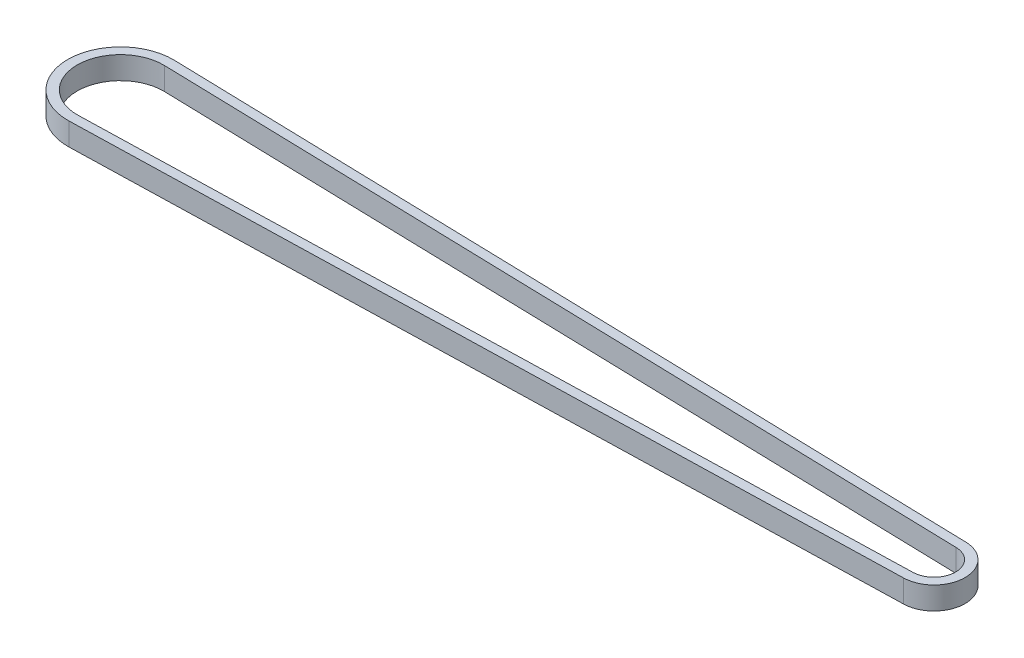
ISO-10303-21;
HEADER;
FILE_DESCRIPTION(('STEP AP214'),'2;1');
FILE_NAME('part.step','',(''),(''),'','','');
FILE_SCHEMA(('AUTOMOTIVE_DESIGN { 1 0 10303 214 1 1 1 1 }'));
ENDSEC;
DATA;
#1=APPLICATION_CONTEXT('core data for automotive mechanical design processes');
#2=APPLICATION_PROTOCOL_DEFINITION('international standard','automotive_design',2000,#1);
#3=PRODUCT_CONTEXT('',#1,'mechanical');
#4=PRODUCT('Part','Part','',(#3));
#5=PRODUCT_RELATED_PRODUCT_CATEGORY('part','',(#4));
#6=PRODUCT_DEFINITION_FORMATION('','',#4);
#7=PRODUCT_DEFINITION_CONTEXT('part definition',#1,'design');
#8=PRODUCT_DEFINITION('design','',#6,#7);
#9=PRODUCT_DEFINITION_SHAPE('','',#8);
#10=(LENGTH_UNIT() NAMED_UNIT(*) SI_UNIT(.MILLI.,.METRE.));
#11=(NAMED_UNIT(*) PLANE_ANGLE_UNIT() SI_UNIT($,.RADIAN.));
#12=(NAMED_UNIT(*) SI_UNIT($,.STERADIAN.) SOLID_ANGLE_UNIT());
#13=UNCERTAINTY_MEASURE_WITH_UNIT(LENGTH_MEASURE(1.E-05),#10,'distance_accuracy_value','');
#14=(GEOMETRIC_REPRESENTATION_CONTEXT(3) GLOBAL_UNCERTAINTY_ASSIGNED_CONTEXT((#13)) GLOBAL_UNIT_ASSIGNED_CONTEXT((#10,
#11,#12)) REPRESENTATION_CONTEXT('',''));
#15=CARTESIAN_POINT('',(0.,0.,0.));
#16=DIRECTION('',(0.,0.,1.));
#17=DIRECTION('',(1.,0.,0.));
#18=AXIS2_PLACEMENT_3D('',#15,#16,#17);
#19=CARTESIAN_POINT('',(-107.95,5.9944,0.));
#20=DIRECTION('',(0.,1.,0.));
#21=DIRECTION('',(0.,0.,1.));
#22=AXIS2_PLACEMENT_3D('',#19,#20,#21);
#23=PLANE('',#22);
#24=CARTESIAN_POINT('',(-107.95,5.9944,0.));
#25=DIRECTION('',(0.,1.,0.));
#26=DIRECTION('',(0.,0.,1.));
#27=AXIS2_PLACEMENT_3D('',#24,#25,#26);
#28=CIRCLE('',#27,13.97);
#29=CARTESIAN_POINT('',(-107.580205882353,5.9944,-13.9651048084343));
#30=VERTEX_POINT('',#29);
#31=CARTESIAN_POINT('',(-107.580205882353,5.9944,13.9651048084343));
#32=VERTEX_POINT('',#31);
#33=EDGE_CURVE('E159',#30,#32,#28,.T.);
#34=ORIENTED_EDGE('',*,*,#33,.T.);
#35=DIRECTION('',(0.999649592586561,0.,-0.0264705882352941));
#36=VECTOR('',#35,1.);
#37=CARTESIAN_POINT('',(-107.580205882353,5.9944,13.9651048084343));
#38=LINE('',#37,#36);
#39=CARTESIAN_POINT('',(108.168514705882,5.9944,8.25210738680207));
#40=VERTEX_POINT('',#39);
#41=EDGE_CURVE('E163',#32,#40,#38,.T.);
#42=ORIENTED_EDGE('',*,*,#41,.T.);
#43=CARTESIAN_POINT('',(107.95,5.9944,0.));
#44=DIRECTION('',(0.,1.,0.));
#45=DIRECTION('',(0.,0.,1.));
#46=AXIS2_PLACEMENT_3D('',#43,#44,#45);
#47=CIRCLE('',#46,8.255);
#48=CARTESIAN_POINT('',(108.168514705882,5.9944,-8.25210738680206));
#49=VERTEX_POINT('',#48);
#50=EDGE_CURVE('E167',#40,#49,#47,.T.);
#51=ORIENTED_EDGE('',*,*,#50,.T.);
#52=DIRECTION('',(-0.999649592586561,0.,-0.0264705882352941));
#53=VECTOR('',#52,1.);
#54=CARTESIAN_POINT('',(-107.580205882353,5.9944,-13.9651048084343));
#55=LINE('',#54,#53);
#56=EDGE_CURVE('E170',#49,#30,#55,.T.);
#57=ORIENTED_EDGE('',*,*,#56,.T.);
#58=EDGE_LOOP('',(#34,#42,#51,#57));
#59=FACE_BOUND('',#58,.T.);
#60=DIRECTION('',(0.99964818930839,0.,-0.0265235294117647));
#61=VECTOR('',#60,1.);
#62=CARTESIAN_POINT('',(-107.646162361176,5.9944,11.4513698678033));
#63=LINE('',#62,#61);
#64=CARTESIAN_POINT('',(-107.646162361176,5.9944,11.4513698678033));
#65=VERTEX_POINT('',#64);
#66=CARTESIAN_POINT('',(108.101952504294,5.9944,5.72695448710209));
#67=VERTEX_POINT('',#66);
#68=EDGE_CURVE('E120',#65,#67,#63,.T.);
#69=ORIENTED_EDGE('',*,*,#68,.F.);
#70=CARTESIAN_POINT('',(-107.95,5.9944,0.));
#71=DIRECTION('',(0.,1.,0.));
#72=DIRECTION('',(0.,0.,1.));
#73=AXIS2_PLACEMENT_3D('',#70,#71,#72);
#74=CIRCLE('',#73,11.4554);
#75=CARTESIAN_POINT('',(-107.646162361176,5.9944,-11.4513698678033));
#76=VERTEX_POINT('',#75);
#77=EDGE_CURVE('E111',#76,#65,#74,.T.);
#78=ORIENTED_EDGE('',*,*,#77,.F.);
#79=DIRECTION('',(-0.99964818930839,0.,-0.0265235294117647));
#80=VECTOR('',#79,1.);
#81=CARTESIAN_POINT('',(-107.646162361176,5.9944,-11.4513698678033));
#82=LINE('',#81,#80);
#83=CARTESIAN_POINT('',(108.101952504294,5.9944,-5.72695448710209));
#84=VERTEX_POINT('',#83);
#85=EDGE_CURVE('E137',#84,#76,#82,.T.);
#86=ORIENTED_EDGE('',*,*,#85,.F.);
#87=CARTESIAN_POINT('',(107.95,5.9944,0.));
#88=DIRECTION('',(0.,1.,0.));
#89=DIRECTION('',(0.,0.,1.));
#90=AXIS2_PLACEMENT_3D('',#87,#88,#89);
#91=CIRCLE('',#90,5.72897);
#92=EDGE_CURVE('E133',#67,#84,#91,.T.);
#93=ORIENTED_EDGE('',*,*,#92,.F.);
#94=EDGE_LOOP('',(#69,#78,#86,#93));
#95=FACE_BOUND('',#94,.T.);
#96=ADVANCED_FACE('F45',(#59,#95),#23,.T.);
#97=CARTESIAN_POINT('',(-107.95,0.,0.));
#98=DIRECTION('',(0.,1.,0.));
#99=DIRECTION('',(0.,0.,1.));
#100=AXIS2_PLACEMENT_3D('',#97,#98,#99);
#101=PLANE('',#100);
#102=CARTESIAN_POINT('',(-107.95,0.,0.));
#103=DIRECTION('',(0.,1.,0.));
#104=DIRECTION('',(0.,0.,1.));
#105=AXIS2_PLACEMENT_3D('',#102,#103,#104);
#106=CIRCLE('',#105,13.97);
#107=CARTESIAN_POINT('',(-107.580205882353,0.,-13.9651048084343));
#108=VERTEX_POINT('',#107);
#109=CARTESIAN_POINT('',(-107.580205882353,0.,13.9651048084343));
#110=VERTEX_POINT('',#109);
#111=EDGE_CURVE('E129',#108,#110,#106,.T.);
#112=ORIENTED_EDGE('',*,*,#111,.F.);
#113=DIRECTION('',(-0.999649592586561,0.,-0.0264705882352941));
#114=VECTOR('',#113,1.);
#115=CARTESIAN_POINT('',(-107.580205882353,0.,-13.9651048084343));
#116=LINE('',#115,#114);
#117=CARTESIAN_POINT('',(108.168514705882,0.,-8.25210738680206));
#118=VERTEX_POINT('',#117);
#119=EDGE_CURVE('E164',#118,#108,#116,.T.);
#120=ORIENTED_EDGE('',*,*,#119,.F.);
#121=CARTESIAN_POINT('',(107.95,0.,0.));
#122=DIRECTION('',(0.,1.,0.));
#123=DIRECTION('',(0.,0.,1.));
#124=AXIS2_PLACEMENT_3D('',#121,#122,#123);
#125=CIRCLE('',#124,8.255);
#126=CARTESIAN_POINT('',(108.168514705882,0.,8.25210738680207));
#127=VERTEX_POINT('',#126);
#128=EDGE_CURVE('E180',#127,#118,#125,.T.);
#129=ORIENTED_EDGE('',*,*,#128,.F.);
#130=DIRECTION('',(0.999649592586561,0.,-0.0264705882352941));
#131=VECTOR('',#130,1.);
#132=CARTESIAN_POINT('',(-107.580205882353,0.,13.9651048084343));
#133=LINE('',#132,#131);
#134=EDGE_CURVE('E177',#110,#127,#133,.T.);
#135=ORIENTED_EDGE('',*,*,#134,.F.);
#136=EDGE_LOOP('',(#112,#120,#129,#135));
#137=FACE_BOUND('',#136,.T.);
#138=CARTESIAN_POINT('',(-107.95,0.,0.));
#139=DIRECTION('',(0.,1.,0.));
#140=DIRECTION('',(0.,0.,1.));
#141=AXIS2_PLACEMENT_3D('',#138,#139,#140);
#142=CIRCLE('',#141,11.4554);
#143=CARTESIAN_POINT('',(-107.646162361176,0.,-11.4513698678033));
#144=VERTEX_POINT('',#143);
#145=CARTESIAN_POINT('',(-107.646162361176,0.,11.4513698678033));
#146=VERTEX_POINT('',#145);
#147=EDGE_CURVE('E69',#144,#146,#142,.T.);
#148=ORIENTED_EDGE('',*,*,#147,.T.);
#149=DIRECTION('',(0.99964818930839,0.,-0.0265235294117647));
#150=VECTOR('',#149,1.);
#151=CARTESIAN_POINT('',(-107.646162361176,0.,11.4513698678033));
#152=LINE('',#151,#150);
#153=CARTESIAN_POINT('',(108.101952504294,0.,5.72695448710209));
#154=VERTEX_POINT('',#153);
#155=EDGE_CURVE('E127',#146,#154,#152,.T.);
#156=ORIENTED_EDGE('',*,*,#155,.T.);
#157=CARTESIAN_POINT('',(107.95,0.,0.));
#158=DIRECTION('',(0.,1.,0.));
#159=DIRECTION('',(0.,0.,1.));
#160=AXIS2_PLACEMENT_3D('',#157,#158,#159);
#161=CIRCLE('',#160,5.72897);
#162=CARTESIAN_POINT('',(108.101952504294,0.,-5.72695448710209));
#163=VERTEX_POINT('',#162);
#164=EDGE_CURVE('E146',#154,#163,#161,.T.);
#165=ORIENTED_EDGE('',*,*,#164,.T.);
#166=DIRECTION('',(-0.99964818930839,0.,-0.0265235294117647));
#167=VECTOR('',#166,1.);
#168=CARTESIAN_POINT('',(-107.646162361176,0.,-11.4513698678033));
#169=LINE('',#168,#167);
#170=EDGE_CURVE('E121',#163,#144,#169,.T.);
#171=ORIENTED_EDGE('',*,*,#170,.T.);
#172=EDGE_LOOP('',(#148,#156,#165,#171));
#173=FACE_BOUND('',#172,.T.);
#174=ADVANCED_FACE('F203',(#137,#173),#101,.F.);
#175=CARTESIAN_POINT('',(-107.95,5.9944,0.));
#176=DIRECTION('',(0.,-1.,0.));
#177=DIRECTION('',(0.,0.,-1.));
#178=AXIS2_PLACEMENT_3D('',#175,#176,#177);
#179=CYLINDRICAL_SURFACE('',#178,13.97);
#180=ORIENTED_EDGE('',*,*,#111,.T.);
#181=DIRECTION('',(0.,-1.,0.));
#182=VECTOR('',#181,1.);
#183=CARTESIAN_POINT('',(-107.580205882353,5.9944,13.9651048084343));
#184=LINE('',#183,#182);
#185=EDGE_CURVE('E11',#32,#110,#184,.T.);
#186=ORIENTED_EDGE('',*,*,#185,.F.);
#187=ORIENTED_EDGE('',*,*,#33,.F.);
#188=DIRECTION('',(0.,-1.,0.));
#189=VECTOR('',#188,1.);
#190=CARTESIAN_POINT('',(-107.580205882353,5.9944,-13.9651048084343));
#191=LINE('',#190,#189);
#192=EDGE_CURVE('E173',#30,#108,#191,.T.);
#193=ORIENTED_EDGE('',*,*,#192,.T.);
#194=EDGE_LOOP('',(#180,#186,#187,#193));
#195=FACE_BOUND('',#194,.T.);
#196=ADVANCED_FACE('F47',(#195),#179,.T.);
#197=CARTESIAN_POINT('',(-107.580205882353,5.9944,13.9651048084343));
#198=DIRECTION('',(-0.0264705882352941,0.,-0.999649592586561));
#199=DIRECTION('',(-0.999649592586561,0.,0.0264705882352941));
#200=AXIS2_PLACEMENT_3D('',#197,#198,#199);
#201=PLANE('',#200);
#202=ORIENTED_EDGE('',*,*,#134,.T.);
#203=DIRECTION('',(0.,-1.,0.));
#204=VECTOR('',#203,1.);
#205=CARTESIAN_POINT('',(108.168514705882,5.9944,8.25210738680207));
#206=LINE('',#205,#204);
#207=EDGE_CURVE('E54',#40,#127,#206,.T.);
#208=ORIENTED_EDGE('',*,*,#207,.F.);
#209=ORIENTED_EDGE('',*,*,#41,.F.);
#210=ORIENTED_EDGE('',*,*,#185,.T.);
#211=EDGE_LOOP('',(#202,#208,#209,#210));
#212=FACE_BOUND('',#211,.T.);
#213=ADVANCED_FACE('F213',(#212),#201,.F.);
#214=CARTESIAN_POINT('',(107.95,5.9944,0.));
#215=DIRECTION('',(0.,-1.,0.));
#216=DIRECTION('',(0.,0.,-1.));
#217=AXIS2_PLACEMENT_3D('',#214,#215,#216);
#218=CYLINDRICAL_SURFACE('',#217,8.255);
#219=ORIENTED_EDGE('',*,*,#128,.T.);
#220=DIRECTION('',(0.,-1.,0.));
#221=VECTOR('',#220,1.);
#222=CARTESIAN_POINT('',(108.168514705882,5.9944,-8.25210738680206));
#223=LINE('',#222,#221);
#224=EDGE_CURVE('E188',#49,#118,#223,.T.);
#225=ORIENTED_EDGE('',*,*,#224,.F.);
#226=ORIENTED_EDGE('',*,*,#50,.F.);
#227=ORIENTED_EDGE('',*,*,#207,.T.);
#228=EDGE_LOOP('',(#219,#225,#226,#227));
#229=FACE_BOUND('',#228,.T.);
#230=ADVANCED_FACE('F197',(#229),#218,.T.);
#231=CARTESIAN_POINT('',(-107.580205882353,5.9944,-13.9651048084343));
#232=DIRECTION('',(-0.0264705882352941,0.,0.999649592586561));
#233=DIRECTION('',(0.999649592586561,0.,0.0264705882352941));
#234=AXIS2_PLACEMENT_3D('',#231,#232,#233);
#235=PLANE('',#234);
#236=ORIENTED_EDGE('',*,*,#119,.T.);
#237=ORIENTED_EDGE('',*,*,#192,.F.);
#238=ORIENTED_EDGE('',*,*,#56,.F.);
#239=ORIENTED_EDGE('',*,*,#224,.T.);
#240=EDGE_LOOP('',(#236,#237,#238,#239));
#241=FACE_BOUND('',#240,.T.);
#242=ADVANCED_FACE('F207',(#241),#235,.F.);
#243=CARTESIAN_POINT('',(-107.95,5.9944,0.));
#244=DIRECTION('',(0.,-1.,0.));
#245=DIRECTION('',(0.,0.,-1.));
#246=AXIS2_PLACEMENT_3D('',#243,#244,#245);
#247=CYLINDRICAL_SURFACE('',#246,11.4554);
#248=ORIENTED_EDGE('',*,*,#147,.F.);
#249=DIRECTION('',(0.,-1.,0.));
#250=VECTOR('',#249,1.);
#251=CARTESIAN_POINT('',(-107.646162361176,5.9944,-11.4513698678033));
#252=LINE('',#251,#250);
#253=EDGE_CURVE('E115',#76,#144,#252,.T.);
#254=ORIENTED_EDGE('',*,*,#253,.F.);
#255=ORIENTED_EDGE('',*,*,#77,.T.);
#256=DIRECTION('',(0.,-1.,0.));
#257=VECTOR('',#256,1.);
#258=CARTESIAN_POINT('',(-107.646162361176,5.9944,11.4513698678033));
#259=LINE('',#258,#257);
#260=EDGE_CURVE('E114',#65,#146,#259,.T.);
#261=ORIENTED_EDGE('',*,*,#260,.T.);
#262=EDGE_LOOP('',(#248,#254,#255,#261));
#263=FACE_BOUND('',#262,.T.);
#264=ADVANCED_FACE('F113',(#263),#247,.F.);
#265=CARTESIAN_POINT('',(-107.646162361176,5.9944,11.4513698678033));
#266=DIRECTION('',(-0.0265235294117647,0.,-0.99964818930839));
#267=DIRECTION('',(-0.99964818930839,0.,0.0265235294117647));
#268=AXIS2_PLACEMENT_3D('',#265,#266,#267);
#269=PLANE('',#268);
#270=ORIENTED_EDGE('',*,*,#155,.F.);
#271=ORIENTED_EDGE('',*,*,#260,.F.);
#272=ORIENTED_EDGE('',*,*,#68,.T.);
#273=DIRECTION('',(0.,-1.,0.));
#274=VECTOR('',#273,1.);
#275=CARTESIAN_POINT('',(108.101952504294,5.9944,5.72695448710209));
#276=LINE('',#275,#274);
#277=EDGE_CURVE('E130',#67,#154,#276,.T.);
#278=ORIENTED_EDGE('',*,*,#277,.T.);
#279=EDGE_LOOP('',(#270,#271,#272,#278));
#280=FACE_BOUND('',#279,.T.);
#281=ADVANCED_FACE('F124',(#280),#269,.T.);
#282=CARTESIAN_POINT('',(107.95,5.9944,0.));
#283=DIRECTION('',(0.,-1.,0.));
#284=DIRECTION('',(0.,0.,-1.));
#285=AXIS2_PLACEMENT_3D('',#282,#283,#284);
#286=CYLINDRICAL_SURFACE('',#285,5.72897);
#287=ORIENTED_EDGE('',*,*,#164,.F.);
#288=ORIENTED_EDGE('',*,*,#277,.F.);
#289=ORIENTED_EDGE('',*,*,#92,.T.);
#290=DIRECTION('',(0.,-1.,0.));
#291=VECTOR('',#290,1.);
#292=CARTESIAN_POINT('',(108.101952504294,5.9944,-5.72695448710209));
#293=LINE('',#292,#291);
#294=EDGE_CURVE('E61',#84,#163,#293,.T.);
#295=ORIENTED_EDGE('',*,*,#294,.T.);
#296=EDGE_LOOP('',(#287,#288,#289,#295));
#297=FACE_BOUND('',#296,.T.);
#298=ADVANCED_FACE('F236',(#297),#286,.F.);
#299=CARTESIAN_POINT('',(-107.646162361176,5.9944,-11.4513698678033));
#300=DIRECTION('',(-0.0265235294117647,0.,0.99964818930839));
#301=DIRECTION('',(0.99964818930839,0.,0.0265235294117647));
#302=AXIS2_PLACEMENT_3D('',#299,#300,#301);
#303=PLANE('',#302);
#304=ORIENTED_EDGE('',*,*,#170,.F.);
#305=ORIENTED_EDGE('',*,*,#294,.F.);
#306=ORIENTED_EDGE('',*,*,#85,.T.);
#307=ORIENTED_EDGE('',*,*,#253,.T.);
#308=EDGE_LOOP('',(#304,#305,#306,#307));
#309=FACE_BOUND('',#308,.T.);
#310=ADVANCED_FACE('F240',(#309),#303,.T.);
#311=CLOSED_SHELL('',(#96,#174,#196,#213,#230,#242,#264,#281,#298,#310));
#312=MANIFOLD_SOLID_BREP('B2',#311);
#313=ADVANCED_BREP_SHAPE_REPRESENTATION('',(#18,#312),#14);
#314=SHAPE_DEFINITION_REPRESENTATION(#9,#313);
ENDSEC;
END-ISO-10303-21;
